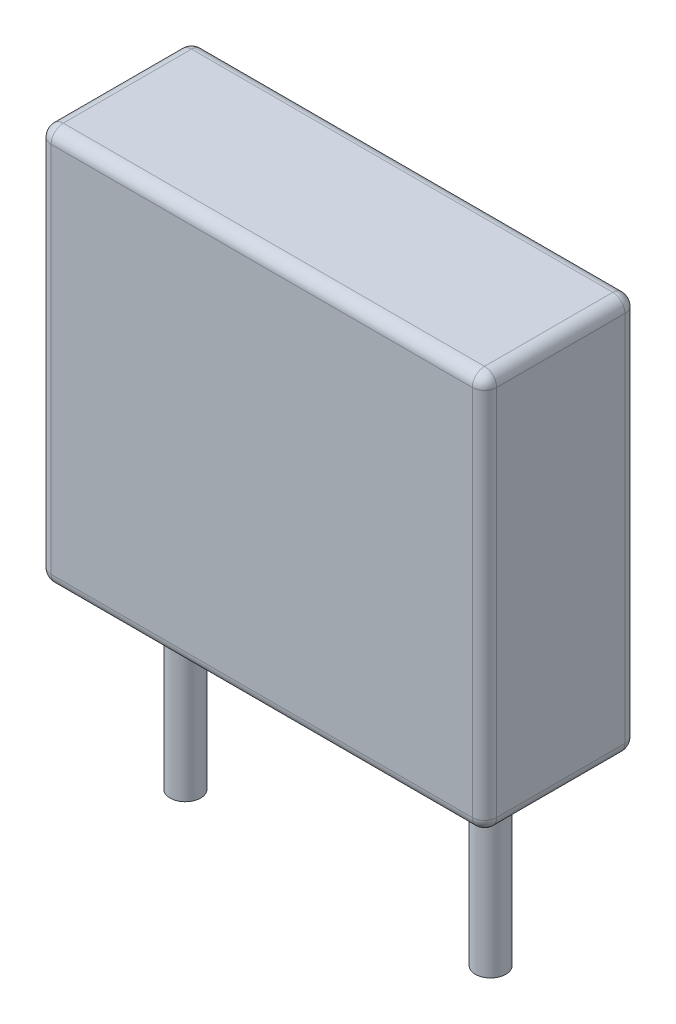
ISO-10303-21;
HEADER;
FILE_DESCRIPTION(('STEP AP214'),'2;1');
FILE_NAME('part.step','',(''),(''),'','','');
FILE_SCHEMA(('AUTOMOTIVE_DESIGN { 1 0 10303 214 1 1 1 1 }'));
ENDSEC;
DATA;
#1=APPLICATION_CONTEXT('core data for automotive mechanical design processes');
#2=APPLICATION_PROTOCOL_DEFINITION('international standard','automotive_design',2000,#1);
#3=PRODUCT_CONTEXT('',#1,'mechanical');
#4=PRODUCT('Part','Part','',(#3));
#5=PRODUCT_RELATED_PRODUCT_CATEGORY('part','',(#4));
#6=PRODUCT_DEFINITION_FORMATION('','',#4);
#7=PRODUCT_DEFINITION_CONTEXT('part definition',#1,'design');
#8=PRODUCT_DEFINITION('design','',#6,#7);
#9=PRODUCT_DEFINITION_SHAPE('','',#8);
#10=(LENGTH_UNIT() NAMED_UNIT(*) SI_UNIT(.MILLI.,.METRE.));
#11=(NAMED_UNIT(*) PLANE_ANGLE_UNIT() SI_UNIT($,.RADIAN.));
#12=(NAMED_UNIT(*) SI_UNIT($,.STERADIAN.) SOLID_ANGLE_UNIT());
#13=UNCERTAINTY_MEASURE_WITH_UNIT(LENGTH_MEASURE(1.E-05),#10,'distance_accuracy_value','');
#14=(GEOMETRIC_REPRESENTATION_CONTEXT(3) GLOBAL_UNCERTAINTY_ASSIGNED_CONTEXT((#13)) GLOBAL_UNIT_ASSIGNED_CONTEXT((#10,
#11,#12)) REPRESENTATION_CONTEXT('',''));
#15=CARTESIAN_POINT('',(0.,0.,0.));
#16=DIRECTION('',(0.,0.,1.));
#17=DIRECTION('',(1.,0.,0.));
#18=AXIS2_PLACEMENT_3D('',#15,#16,#17);
#19=CARTESIAN_POINT('',(2.5,-3.,0.));
#20=DIRECTION('',(0.,1.,0.));
#21=DIRECTION('',(0.,0.,1.));
#22=AXIS2_PLACEMENT_3D('',#19,#20,#21);
#23=CYLINDRICAL_SURFACE('',#22,0.25);
#24=CARTESIAN_POINT('',(2.5,-3.,0.));
#25=DIRECTION('',(0.,1.,0.));
#26=DIRECTION('',(0.,0.,1.));
#27=AXIS2_PLACEMENT_3D('',#24,#25,#26);
#28=CIRCLE('',#27,0.25);
#29=CARTESIAN_POINT('',(2.5,-3.,0.249999999999999));
#30=VERTEX_POINT('',#29);
#31=EDGE_CURVE('E11',#30,#30,#28,.T.);
#32=ORIENTED_EDGE('',*,*,#31,.T.);
#33=EDGE_LOOP('',(#32));
#34=FACE_BOUND('',#33,.T.);
#35=CARTESIAN_POINT('',(2.5,0.,0.));
#36=DIRECTION('',(0.,1.,0.));
#37=DIRECTION('',(0.,0.,1.));
#38=AXIS2_PLACEMENT_3D('',#35,#36,#37);
#39=CIRCLE('',#38,0.25);
#40=CARTESIAN_POINT('',(2.5,0.,0.249999999999999));
#41=VERTEX_POINT('',#40);
#42=EDGE_CURVE('E42',#41,#41,#39,.T.);
#43=ORIENTED_EDGE('',*,*,#42,.F.);
#44=EDGE_LOOP('',(#43));
#45=FACE_BOUND('',#44,.T.);
#46=ADVANCED_FACE('F39',(#34,#45),#23,.T.);
#47=CARTESIAN_POINT('',(2.5,-3.,0.));
#48=DIRECTION('',(0.,1.,0.));
#49=DIRECTION('',(0.,0.,1.));
#50=AXIS2_PLACEMENT_3D('',#47,#48,#49);
#51=PLANE('',#50);
#52=ORIENTED_EDGE('',*,*,#31,.F.);
#53=EDGE_LOOP('',(#52));
#54=FACE_BOUND('',#53,.T.);
#55=ADVANCED_FACE('F54',(#54),#51,.F.);
#56=CARTESIAN_POINT('',(2.5,0.,0.));
#57=DIRECTION('',(0.,1.,0.));
#58=DIRECTION('',(0.,0.,1.));
#59=AXIS2_PLACEMENT_3D('',#56,#57,#58);
#60=PLANE('',#59);
#61=ORIENTED_EDGE('',*,*,#42,.T.);
#62=EDGE_LOOP('',(#61));
#63=FACE_BOUND('',#62,.T.);
#64=ADVANCED_FACE('F51',(#63),#60,.T.);
#65=CLOSED_SHELL('',(#46,#55,#64));
#66=MANIFOLD_SOLID_BREP('B2',#65);
#67=CARTESIAN_POINT('',(-2.5,-3.,0.));
#68=DIRECTION('',(0.,1.,0.));
#69=DIRECTION('',(0.,0.,1.));
#70=AXIS2_PLACEMENT_3D('',#67,#68,#69);
#71=CYLINDRICAL_SURFACE('',#70,0.25);
#72=CARTESIAN_POINT('',(-2.5,-3.,0.));
#73=DIRECTION('',(0.,1.,0.));
#74=DIRECTION('',(0.,0.,1.));
#75=AXIS2_PLACEMENT_3D('',#72,#73,#74);
#76=CIRCLE('',#75,0.25);
#77=CARTESIAN_POINT('',(-2.5,-3.,0.250000000000001));
#78=VERTEX_POINT('',#77);
#79=EDGE_CURVE('E38',#78,#78,#76,.T.);
#80=ORIENTED_EDGE('',*,*,#79,.T.);
#81=EDGE_LOOP('',(#80));
#82=FACE_BOUND('',#81,.T.);
#83=CARTESIAN_POINT('',(-2.5,0.,0.));
#84=DIRECTION('',(0.,1.,0.));
#85=DIRECTION('',(0.,0.,1.));
#86=AXIS2_PLACEMENT_3D('',#83,#84,#85);
#87=CIRCLE('',#86,0.25);
#88=CARTESIAN_POINT('',(-2.5,0.,0.250000000000001));
#89=VERTEX_POINT('',#88);
#90=EDGE_CURVE('E91',#89,#89,#87,.T.);
#91=ORIENTED_EDGE('',*,*,#90,.F.);
#92=EDGE_LOOP('',(#91));
#93=FACE_BOUND('',#92,.T.);
#94=ADVANCED_FACE('F88',(#82,#93),#71,.T.);
#95=CARTESIAN_POINT('',(-2.5,-3.,0.));
#96=DIRECTION('',(0.,1.,0.));
#97=DIRECTION('',(0.,0.,1.));
#98=AXIS2_PLACEMENT_3D('',#95,#96,#97);
#99=PLANE('',#98);
#100=ORIENTED_EDGE('',*,*,#79,.F.);
#101=EDGE_LOOP('',(#100));
#102=FACE_BOUND('',#101,.T.);
#103=ADVANCED_FACE('F103',(#102),#99,.F.);
#104=CARTESIAN_POINT('',(-2.5,0.,0.));
#105=DIRECTION('',(0.,1.,0.));
#106=DIRECTION('',(0.,0.,1.));
#107=AXIS2_PLACEMENT_3D('',#104,#105,#106);
#108=PLANE('',#107);
#109=ORIENTED_EDGE('',*,*,#90,.T.);
#110=EDGE_LOOP('',(#109));
#111=FACE_BOUND('',#110,.T.);
#112=ADVANCED_FACE('F100',(#111),#108,.T.);
#113=CLOSED_SHELL('',(#94,#103,#112));
#114=MANIFOLD_SOLID_BREP('B6',#113);
#115=CARTESIAN_POINT('',(-3.65,6.5,1.25));
#116=DIRECTION('',(1.,0.,0.));
#117=DIRECTION('',(0.,0.,-1.));
#118=AXIS2_PLACEMENT_3D('',#115,#116,#117);
#119=PLANE('',#118);
#120=DIRECTION('',(0.,-1.,0.));
#121=VECTOR('',#120,1.);
#122=CARTESIAN_POINT('',(-3.65,6.5,-1.05));
#123=LINE('',#122,#121);
#124=CARTESIAN_POINT('',(-3.65,6.3,-1.05));
#125=VERTEX_POINT('',#124);
#126=CARTESIAN_POINT('',(-3.65,0.2,-1.05));
#127=VERTEX_POINT('',#126);
#128=EDGE_CURVE('E226',#125,#127,#123,.T.);
#129=ORIENTED_EDGE('',*,*,#128,.T.);
#130=DIRECTION('',(0.,0.,1.));
#131=VECTOR('',#130,1.);
#132=CARTESIAN_POINT('',(-3.65,0.2,1.25));
#133=LINE('',#132,#131);
#134=CARTESIAN_POINT('',(-3.65,0.2,1.05));
#135=VERTEX_POINT('',#134);
#136=EDGE_CURVE('E222',#127,#135,#133,.T.);
#137=ORIENTED_EDGE('',*,*,#136,.T.);
#138=DIRECTION('',(0.,-1.,0.));
#139=VECTOR('',#138,1.);
#140=CARTESIAN_POINT('',(-3.65,6.5,1.05));
#141=LINE('',#140,#139);
#142=CARTESIAN_POINT('',(-3.65,6.3,1.05));
#143=VERTEX_POINT('',#142);
#144=EDGE_CURVE('E217',#135,#143,#141,.F.);
#145=ORIENTED_EDGE('',*,*,#144,.T.);
#146=DIRECTION('',(0.,0.,1.));
#147=VECTOR('',#146,1.);
#148=CARTESIAN_POINT('',(-3.65,6.3,-1.25));
#149=LINE('',#148,#147);
#150=EDGE_CURVE('E219',#143,#125,#149,.F.);
#151=ORIENTED_EDGE('',*,*,#150,.T.);
#152=EDGE_LOOP('',(#129,#137,#145,#151));
#153=FACE_BOUND('',#152,.T.);
#154=ADVANCED_FACE('F129',(#153),#119,.F.);
#155=CARTESIAN_POINT('',(3.65,6.5,1.25));
#156=DIRECTION('',(0.,0.,-1.));
#157=DIRECTION('',(-1.,0.,0.));
#158=AXIS2_PLACEMENT_3D('',#155,#156,#157);
#159=PLANE('',#158);
#160=DIRECTION('',(0.,-1.,0.));
#161=VECTOR('',#160,1.);
#162=CARTESIAN_POINT('',(-3.45,6.5,1.25));
#163=LINE('',#162,#161);
#164=CARTESIAN_POINT('',(-3.45,6.3,1.25));
#165=VERTEX_POINT('',#164);
#166=CARTESIAN_POINT('',(-3.45,0.2,1.25));
#167=VERTEX_POINT('',#166);
#168=EDGE_CURVE('E248',#165,#167,#163,.T.);
#169=ORIENTED_EDGE('',*,*,#168,.T.);
#170=DIRECTION('',(1.,0.,0.));
#171=VECTOR('',#170,1.);
#172=CARTESIAN_POINT('',(3.65,0.2,1.25));
#173=LINE('',#172,#171);
#174=CARTESIAN_POINT('',(3.45,0.2,1.25));
#175=VERTEX_POINT('',#174);
#176=EDGE_CURVE('E326',#167,#175,#173,.T.);
#177=ORIENTED_EDGE('',*,*,#176,.T.);
#178=DIRECTION('',(0.,-1.,0.));
#179=VECTOR('',#178,1.);
#180=CARTESIAN_POINT('',(3.45,6.5,1.25));
#181=LINE('',#180,#179);
#182=CARTESIAN_POINT('',(3.45,6.3,1.25));
#183=VERTEX_POINT('',#182);
#184=EDGE_CURVE('E319',#175,#183,#181,.F.);
#185=ORIENTED_EDGE('',*,*,#184,.T.);
#186=DIRECTION('',(1.,0.,0.));
#187=VECTOR('',#186,1.);
#188=CARTESIAN_POINT('',(-3.65,6.3,1.25));
#189=LINE('',#188,#187);
#190=EDGE_CURVE('E317',#183,#165,#189,.F.);
#191=ORIENTED_EDGE('',*,*,#190,.T.);
#192=EDGE_LOOP('',(#169,#177,#185,#191));
#193=FACE_BOUND('',#192,.T.);
#194=ADVANCED_FACE('F416',(#193),#159,.F.);
#195=CARTESIAN_POINT('',(3.65,6.5,1.25));
#196=DIRECTION('',(-1.,0.,0.));
#197=DIRECTION('',(0.,0.,1.));
#198=AXIS2_PLACEMENT_3D('',#195,#196,#197);
#199=PLANE('',#198);
#200=DIRECTION('',(0.,0.,-1.));
#201=VECTOR('',#200,1.);
#202=CARTESIAN_POINT('',(3.65,0.2,1.25));
#203=LINE('',#202,#201);
#204=CARTESIAN_POINT('',(3.65,0.2,1.05));
#205=VERTEX_POINT('',#204);
#206=CARTESIAN_POINT('',(3.65,0.2,-1.05));
#207=VERTEX_POINT('',#206);
#208=EDGE_CURVE('E313',#205,#207,#203,.T.);
#209=ORIENTED_EDGE('',*,*,#208,.T.);
#210=DIRECTION('',(0.,-1.,0.));
#211=VECTOR('',#210,1.);
#212=CARTESIAN_POINT('',(3.65,6.5,-1.05));
#213=LINE('',#212,#211);
#214=CARTESIAN_POINT('',(3.65,6.3,-1.05));
#215=VERTEX_POINT('',#214);
#216=EDGE_CURVE('E310',#207,#215,#213,.F.);
#217=ORIENTED_EDGE('',*,*,#216,.T.);
#218=DIRECTION('',(0.,0.,-1.));
#219=VECTOR('',#218,1.);
#220=CARTESIAN_POINT('',(3.65,6.3,1.25));
#221=LINE('',#220,#219);
#222=CARTESIAN_POINT('',(3.65,6.3,1.05));
#223=VERTEX_POINT('',#222);
#224=EDGE_CURVE('E303',#215,#223,#221,.F.);
#225=ORIENTED_EDGE('',*,*,#224,.T.);
#226=DIRECTION('',(0.,-1.,0.));
#227=VECTOR('',#226,1.);
#228=CARTESIAN_POINT('',(3.65,6.5,1.05));
#229=LINE('',#228,#227);
#230=EDGE_CURVE('E306',#223,#205,#229,.T.);
#231=ORIENTED_EDGE('',*,*,#230,.T.);
#232=EDGE_LOOP('',(#209,#217,#225,#231));
#233=FACE_BOUND('',#232,.T.);
#234=ADVANCED_FACE('F311',(#233),#199,.F.);
#235=CARTESIAN_POINT('',(3.65,6.5,-1.25));
#236=DIRECTION('',(0.,0.,1.));
#237=DIRECTION('',(1.,0.,0.));
#238=AXIS2_PLACEMENT_3D('',#235,#236,#237);
#239=PLANE('',#238);
#240=DIRECTION('',(-1.,0.,0.));
#241=VECTOR('',#240,1.);
#242=CARTESIAN_POINT('',(3.65,0.2,-1.25));
#243=LINE('',#242,#241);
#244=CARTESIAN_POINT('',(3.45,0.2,-1.25));
#245=VERTEX_POINT('',#244);
#246=CARTESIAN_POINT('',(-3.45,0.2,-1.25));
#247=VERTEX_POINT('',#246);
#248=EDGE_CURVE('E375',#245,#247,#243,.T.);
#249=ORIENTED_EDGE('',*,*,#248,.T.);
#250=DIRECTION('',(0.,-1.,0.));
#251=VECTOR('',#250,1.);
#252=CARTESIAN_POINT('',(-3.45,6.5,-1.25));
#253=LINE('',#252,#251);
#254=CARTESIAN_POINT('',(-3.45,6.3,-1.25));
#255=VERTEX_POINT('',#254);
#256=EDGE_CURVE('E307',#247,#255,#253,.F.);
#257=ORIENTED_EDGE('',*,*,#256,.T.);
#258=DIRECTION('',(-1.,0.,0.));
#259=VECTOR('',#258,1.);
#260=CARTESIAN_POINT('',(3.65,6.3,-1.25));
#261=LINE('',#260,#259);
#262=CARTESIAN_POINT('',(3.45,6.3,-1.25));
#263=VERTEX_POINT('',#262);
#264=EDGE_CURVE('E368',#255,#263,#261,.F.);
#265=ORIENTED_EDGE('',*,*,#264,.T.);
#266=DIRECTION('',(0.,-1.,0.));
#267=VECTOR('',#266,1.);
#268=CARTESIAN_POINT('',(3.45,6.5,-1.25));
#269=LINE('',#268,#267);
#270=EDGE_CURVE('E370',#263,#245,#269,.T.);
#271=ORIENTED_EDGE('',*,*,#270,.T.);
#272=EDGE_LOOP('',(#249,#257,#265,#271));
#273=FACE_BOUND('',#272,.T.);
#274=ADVANCED_FACE('F400',(#273),#239,.F.);
#275=CARTESIAN_POINT('',(0.,6.5,0.));
#276=DIRECTION('',(0.,1.,0.));
#277=DIRECTION('',(0.,0.,1.));
#278=AXIS2_PLACEMENT_3D('',#275,#276,#277);
#279=PLANE('',#278);
#280=DIRECTION('',(0.,0.,-1.));
#281=VECTOR('',#280,1.);
#282=CARTESIAN_POINT('',(3.45,6.5,-1.25));
#283=LINE('',#282,#281);
#284=CARTESIAN_POINT('',(3.45,6.5,1.05));
#285=VERTEX_POINT('',#284);
#286=CARTESIAN_POINT('',(3.45,6.5,-1.05));
#287=VERTEX_POINT('',#286);
#288=EDGE_CURVE('E138',#285,#287,#283,.T.);
#289=ORIENTED_EDGE('',*,*,#288,.T.);
#290=DIRECTION('',(-1.,0.,0.));
#291=VECTOR('',#290,1.);
#292=CARTESIAN_POINT('',(-3.65,6.5,-1.05));
#293=LINE('',#292,#291);
#294=CARTESIAN_POINT('',(-3.45,6.5,-1.05));
#295=VERTEX_POINT('',#294);
#296=EDGE_CURVE('E86',#287,#295,#293,.T.);
#297=ORIENTED_EDGE('',*,*,#296,.T.);
#298=DIRECTION('',(0.,0.,1.));
#299=VECTOR('',#298,1.);
#300=CARTESIAN_POINT('',(-3.45,6.5,1.25));
#301=LINE('',#300,#299);
#302=CARTESIAN_POINT('',(-3.45,6.5,1.05));
#303=VERTEX_POINT('',#302);
#304=EDGE_CURVE('E328',#295,#303,#301,.T.);
#305=ORIENTED_EDGE('',*,*,#304,.T.);
#306=DIRECTION('',(1.,0.,0.));
#307=VECTOR('',#306,1.);
#308=CARTESIAN_POINT('',(3.65,6.5,1.05));
#309=LINE('',#308,#307);
#310=EDGE_CURVE('E149',#303,#285,#309,.T.);
#311=ORIENTED_EDGE('',*,*,#310,.T.);
#312=EDGE_LOOP('',(#289,#297,#305,#311));
#313=FACE_BOUND('',#312,.T.);
#314=ADVANCED_FACE('F579',(#313),#279,.T.);
#315=CARTESIAN_POINT('',(0.,0.,0.));
#316=DIRECTION('',(0.,1.,0.));
#317=DIRECTION('',(0.,0.,1.));
#318=AXIS2_PLACEMENT_3D('',#315,#316,#317);
#319=PLANE('',#318);
#320=DIRECTION('',(1.,0.,0.));
#321=VECTOR('',#320,1.);
#322=CARTESIAN_POINT('',(0.,0.,1.05));
#323=LINE('',#322,#321);
#324=CARTESIAN_POINT('',(3.45,0.,1.05));
#325=VERTEX_POINT('',#324);
#326=CARTESIAN_POINT('',(-3.45,0.,1.05));
#327=VERTEX_POINT('',#326);
#328=EDGE_CURVE('E364',#325,#327,#323,.F.);
#329=ORIENTED_EDGE('',*,*,#328,.T.);
#330=DIRECTION('',(0.,0.,1.));
#331=VECTOR('',#330,1.);
#332=CARTESIAN_POINT('',(-3.45,0.,0.));
#333=LINE('',#332,#331);
#334=CARTESIAN_POINT('',(-3.45,0.,-1.05));
#335=VERTEX_POINT('',#334);
#336=EDGE_CURVE('E358',#327,#335,#333,.F.);
#337=ORIENTED_EDGE('',*,*,#336,.T.);
#338=DIRECTION('',(-1.,0.,0.));
#339=VECTOR('',#338,1.);
#340=CARTESIAN_POINT('',(0.,0.,-1.05));
#341=LINE('',#340,#339);
#342=CARTESIAN_POINT('',(3.45,0.,-1.05));
#343=VERTEX_POINT('',#342);
#344=EDGE_CURVE('E352',#335,#343,#341,.F.);
#345=ORIENTED_EDGE('',*,*,#344,.T.);
#346=DIRECTION('',(0.,0.,-1.));
#347=VECTOR('',#346,1.);
#348=CARTESIAN_POINT('',(3.45,0.,0.));
#349=LINE('',#348,#347);
#350=EDGE_CURVE('E359',#343,#325,#349,.F.);
#351=ORIENTED_EDGE('',*,*,#350,.T.);
#352=EDGE_LOOP('',(#329,#337,#345,#351));
#353=FACE_BOUND('',#352,.T.);
#354=ADVANCED_FACE('F362',(#353),#319,.F.);
#355=CARTESIAN_POINT('',(3.45,6.3,0.));
#356=DIRECTION('',(0.,0.,1.));
#357=DIRECTION('',(1.,0.,0.));
#358=AXIS2_PLACEMENT_3D('',#355,#356,#357);
#359=CYLINDRICAL_SURFACE('',#358,0.2);
#360=CARTESIAN_POINT('',(3.45,6.3,-1.05));
#361=DIRECTION('',(0.,0.,-1.));
#362=DIRECTION('',(-1.,0.,0.));
#363=AXIS2_PLACEMENT_3D('',#360,#361,#362);
#364=CIRCLE('',#363,0.2);
#365=EDGE_CURVE('E133',#287,#215,#364,.T.);
#366=ORIENTED_EDGE('',*,*,#365,.F.);
#367=ORIENTED_EDGE('',*,*,#288,.F.);
#368=CARTESIAN_POINT('',(3.45,6.3,1.05));
#369=DIRECTION('',(0.,0.,1.));
#370=DIRECTION('',(1.,0.,0.));
#371=AXIS2_PLACEMENT_3D('',#368,#369,#370);
#372=CIRCLE('',#371,0.2);
#373=EDGE_CURVE('E288',#223,#285,#372,.T.);
#374=ORIENTED_EDGE('',*,*,#373,.F.);
#375=ORIENTED_EDGE('',*,*,#224,.F.);
#376=EDGE_LOOP('',(#366,#367,#374,#375));
#377=FACE_BOUND('',#376,.T.);
#378=ADVANCED_FACE('F131',(#377),#359,.T.);
#379=CARTESIAN_POINT('',(3.45,6.3,-1.05));
#380=DIRECTION('',(1.,0.,0.));
#381=DIRECTION('',(0.,0.,-1.));
#382=AXIS2_PLACEMENT_3D('',#379,#380,#381);
#383=SPHERICAL_SURFACE('',#382,0.2);
#384=CARTESIAN_POINT('',(3.45,6.3,-1.05));
#385=DIRECTION('',(1.,0.,0.));
#386=DIRECTION('',(0.,0.,-1.));
#387=AXIS2_PLACEMENT_3D('',#384,#385,#386);
#388=CIRCLE('',#387,0.2);
#389=EDGE_CURVE('E284',#287,#263,#388,.F.);
#390=ORIENTED_EDGE('',*,*,#389,.F.);
#391=ORIENTED_EDGE('',*,*,#365,.T.);
#392=CARTESIAN_POINT('',(3.45,6.3,-1.05));
#393=DIRECTION('',(0.,1.,0.));
#394=DIRECTION('',(0.,0.,1.));
#395=AXIS2_PLACEMENT_3D('',#392,#393,#394);
#396=CIRCLE('',#395,0.2);
#397=EDGE_CURVE('E287',#263,#215,#396,.F.);
#398=ORIENTED_EDGE('',*,*,#397,.F.);
#399=EDGE_LOOP('',(#390,#391,#398));
#400=FACE_BOUND('',#399,.T.);
#401=ADVANCED_FACE('F299',(#400),#383,.T.);
#402=CARTESIAN_POINT('',(3.45,6.3,1.05));
#403=DIRECTION('',(0.,1.,0.));
#404=DIRECTION('',(0.,0.,1.));
#405=AXIS2_PLACEMENT_3D('',#402,#403,#404);
#406=SPHERICAL_SURFACE('',#405,0.2);
#407=CARTESIAN_POINT('',(3.45,6.3,1.05));
#408=DIRECTION('',(0.,1.,0.));
#409=DIRECTION('',(0.,0.,1.));
#410=AXIS2_PLACEMENT_3D('',#407,#408,#409);
#411=CIRCLE('',#410,0.2);
#412=EDGE_CURVE('E278',#223,#183,#411,.F.);
#413=ORIENTED_EDGE('',*,*,#412,.F.);
#414=ORIENTED_EDGE('',*,*,#373,.T.);
#415=CARTESIAN_POINT('',(3.45,6.3,1.05));
#416=DIRECTION('',(1.,0.,0.));
#417=DIRECTION('',(0.,0.,-1.));
#418=AXIS2_PLACEMENT_3D('',#415,#416,#417);
#419=CIRCLE('',#418,0.2);
#420=EDGE_CURVE('E281',#183,#285,#419,.F.);
#421=ORIENTED_EDGE('',*,*,#420,.F.);
#422=EDGE_LOOP('',(#413,#414,#421));
#423=FACE_BOUND('',#422,.T.);
#424=ADVANCED_FACE('F552',(#423),#406,.T.);
#425=CARTESIAN_POINT('',(3.45,6.5,-1.05));
#426=DIRECTION('',(0.,-1.,0.));
#427=DIRECTION('',(0.,0.,-1.));
#428=AXIS2_PLACEMENT_3D('',#425,#426,#427);
#429=CYLINDRICAL_SURFACE('',#428,0.2);
#430=ORIENTED_EDGE('',*,*,#397,.T.);
#431=ORIENTED_EDGE('',*,*,#216,.F.);
#432=CARTESIAN_POINT('',(3.45,0.2,-1.05));
#433=DIRECTION('',(0.,-1.,0.));
#434=DIRECTION('',(0.,0.,-1.));
#435=AXIS2_PLACEMENT_3D('',#432,#433,#434);
#436=CIRCLE('',#435,0.2);
#437=EDGE_CURVE('E272',#245,#207,#436,.T.);
#438=ORIENTED_EDGE('',*,*,#437,.F.);
#439=ORIENTED_EDGE('',*,*,#270,.F.);
#440=EDGE_LOOP('',(#430,#431,#438,#439));
#441=FACE_BOUND('',#440,.T.);
#442=ADVANCED_FACE('F402',(#441),#429,.T.);
#443=CARTESIAN_POINT('',(0.,6.3,-1.05));
#444=DIRECTION('',(1.,0.,0.));
#445=DIRECTION('',(0.,0.,-1.));
#446=AXIS2_PLACEMENT_3D('',#443,#444,#445);
#447=CYLINDRICAL_SURFACE('',#446,0.2);
#448=ORIENTED_EDGE('',*,*,#389,.T.);
#449=ORIENTED_EDGE('',*,*,#264,.F.);
#450=CARTESIAN_POINT('',(-3.45,6.3,-1.05));
#451=DIRECTION('',(-1.,0.,0.));
#452=DIRECTION('',(0.,0.,1.));
#453=AXIS2_PLACEMENT_3D('',#450,#451,#452);
#454=CIRCLE('',#453,0.2);
#455=EDGE_CURVE('E269',#295,#255,#454,.T.);
#456=ORIENTED_EDGE('',*,*,#455,.F.);
#457=ORIENTED_EDGE('',*,*,#296,.F.);
#458=EDGE_LOOP('',(#448,#449,#456,#457));
#459=FACE_BOUND('',#458,.T.);
#460=ADVANCED_FACE('F536',(#459),#447,.T.);
#461=CARTESIAN_POINT('',(-3.45,6.3,0.));
#462=DIRECTION('',(0.,0.,-1.));
#463=DIRECTION('',(-1.,0.,0.));
#464=AXIS2_PLACEMENT_3D('',#461,#462,#463);
#465=CYLINDRICAL_SURFACE('',#464,0.2);
#466=CARTESIAN_POINT('',(-3.45,6.3,1.05));
#467=DIRECTION('',(0.,0.,1.));
#468=DIRECTION('',(1.,0.,0.));
#469=AXIS2_PLACEMENT_3D('',#466,#467,#468);
#470=CIRCLE('',#469,0.2);
#471=EDGE_CURVE('E233',#303,#143,#470,.T.);
#472=ORIENTED_EDGE('',*,*,#471,.F.);
#473=ORIENTED_EDGE('',*,*,#304,.F.);
#474=CARTESIAN_POINT('',(-3.45,6.3,-1.05));
#475=DIRECTION('',(0.,0.,-1.));
#476=DIRECTION('',(0.,1.,0.));
#477=AXIS2_PLACEMENT_3D('',#474,#475,#476);
#478=CIRCLE('',#477,0.2);
#479=EDGE_CURVE('E235',#125,#295,#478,.T.);
#480=ORIENTED_EDGE('',*,*,#479,.F.);
#481=ORIENTED_EDGE('',*,*,#150,.F.);
#482=EDGE_LOOP('',(#472,#473,#480,#481));
#483=FACE_BOUND('',#482,.T.);
#484=ADVANCED_FACE('F231',(#483),#465,.T.);
#485=CARTESIAN_POINT('',(0.,6.3,1.05));
#486=DIRECTION('',(-1.,0.,0.));
#487=DIRECTION('',(0.,0.,1.));
#488=AXIS2_PLACEMENT_3D('',#485,#486,#487);
#489=CYLINDRICAL_SURFACE('',#488,0.2);
#490=ORIENTED_EDGE('',*,*,#420,.T.);
#491=ORIENTED_EDGE('',*,*,#310,.F.);
#492=CARTESIAN_POINT('',(-3.45,6.3,1.05));
#493=DIRECTION('',(-1.,0.,0.));
#494=DIRECTION('',(0.,-1.,0.));
#495=AXIS2_PLACEMENT_3D('',#492,#493,#494);
#496=CIRCLE('',#495,0.2);
#497=EDGE_CURVE('E244',#165,#303,#496,.T.);
#498=ORIENTED_EDGE('',*,*,#497,.F.);
#499=ORIENTED_EDGE('',*,*,#190,.F.);
#500=EDGE_LOOP('',(#490,#491,#498,#499));
#501=FACE_BOUND('',#500,.T.);
#502=ADVANCED_FACE('F520',(#501),#489,.T.);
#503=CARTESIAN_POINT('',(3.45,6.5,1.05));
#504=DIRECTION('',(0.,-1.,0.));
#505=DIRECTION('',(0.,0.,-1.));
#506=AXIS2_PLACEMENT_3D('',#503,#504,#505);
#507=CYLINDRICAL_SURFACE('',#506,0.2);
#508=ORIENTED_EDGE('',*,*,#412,.T.);
#509=ORIENTED_EDGE('',*,*,#184,.F.);
#510=CARTESIAN_POINT('',(3.45,0.2,1.05));
#511=DIRECTION('',(0.,-1.,0.));
#512=DIRECTION('',(0.,0.,-1.));
#513=AXIS2_PLACEMENT_3D('',#510,#511,#512);
#514=CIRCLE('',#513,0.2);
#515=EDGE_CURVE('E264',#205,#175,#514,.T.);
#516=ORIENTED_EDGE('',*,*,#515,.F.);
#517=ORIENTED_EDGE('',*,*,#230,.F.);
#518=EDGE_LOOP('',(#508,#509,#516,#517));
#519=FACE_BOUND('',#518,.T.);
#520=ADVANCED_FACE('F386',(#519),#507,.T.);
#521=CARTESIAN_POINT('',(3.45,0.2,1.25));
#522=DIRECTION('',(0.,0.,-1.));
#523=DIRECTION('',(-1.,0.,0.));
#524=AXIS2_PLACEMENT_3D('',#521,#522,#523);
#525=CYLINDRICAL_SURFACE('',#524,0.2);
#526=CARTESIAN_POINT('',(3.45,0.2,-1.05));
#527=DIRECTION('',(0.,0.,-1.));
#528=DIRECTION('',(-1.,0.,0.));
#529=AXIS2_PLACEMENT_3D('',#526,#527,#528);
#530=CIRCLE('',#529,0.2);
#531=EDGE_CURVE('E275',#207,#343,#530,.T.);
#532=ORIENTED_EDGE('',*,*,#531,.F.);
#533=ORIENTED_EDGE('',*,*,#208,.F.);
#534=CARTESIAN_POINT('',(3.45,0.2,1.05));
#535=DIRECTION('',(0.,0.,1.));
#536=DIRECTION('',(1.,0.,0.));
#537=AXIS2_PLACEMENT_3D('',#534,#535,#536);
#538=CIRCLE('',#537,0.2);
#539=EDGE_CURVE('E261',#325,#205,#538,.T.);
#540=ORIENTED_EDGE('',*,*,#539,.F.);
#541=ORIENTED_EDGE('',*,*,#350,.F.);
#542=EDGE_LOOP('',(#532,#533,#540,#541));
#543=FACE_BOUND('',#542,.T.);
#544=ADVANCED_FACE('F383',(#543),#525,.T.);
#545=CARTESIAN_POINT('',(3.45,0.2,-1.05));
#546=DIRECTION('',(1.,0.,0.));
#547=DIRECTION('',(0.,1.,0.));
#548=AXIS2_PLACEMENT_3D('',#545,#546,#547);
#549=SPHERICAL_SURFACE('',#548,0.2);
#550=ORIENTED_EDGE('',*,*,#437,.T.);
#551=ORIENTED_EDGE('',*,*,#531,.T.);
#552=CARTESIAN_POINT('',(3.45,0.2,-1.05));
#553=DIRECTION('',(1.,0.,0.));
#554=DIRECTION('',(0.,0.,-1.));
#555=AXIS2_PLACEMENT_3D('',#552,#553,#554);
#556=CIRCLE('',#555,0.2);
#557=EDGE_CURVE('E252',#245,#343,#556,.F.);
#558=ORIENTED_EDGE('',*,*,#557,.F.);
#559=EDGE_LOOP('',(#550,#551,#558));
#560=FACE_BOUND('',#559,.T.);
#561=ADVANCED_FACE('F404',(#560),#549,.T.);
#562=CARTESIAN_POINT('',(-3.45,6.3,-1.05));
#563=DIRECTION('',(0.,1.,0.));
#564=DIRECTION('',(0.,0.,1.));
#565=AXIS2_PLACEMENT_3D('',#562,#563,#564);
#566=SPHERICAL_SURFACE('',#565,0.2);
#567=ORIENTED_EDGE('',*,*,#479,.T.);
#568=ORIENTED_EDGE('',*,*,#455,.T.);
#569=CARTESIAN_POINT('',(-3.45,6.3,-1.05));
#570=DIRECTION('',(0.,1.,0.));
#571=DIRECTION('',(0.,0.,1.));
#572=AXIS2_PLACEMENT_3D('',#569,#570,#571);
#573=CIRCLE('',#572,0.2);
#574=EDGE_CURVE('E249',#125,#255,#573,.F.);
#575=ORIENTED_EDGE('',*,*,#574,.F.);
#576=EDGE_LOOP('',(#567,#568,#575));
#577=FACE_BOUND('',#576,.T.);
#578=ADVANCED_FACE('F406',(#577),#566,.T.);
#579=CARTESIAN_POINT('',(-3.45,6.3,1.05));
#580=DIRECTION('',(0.,1.,0.));
#581=DIRECTION('',(0.,0.,1.));
#582=AXIS2_PLACEMENT_3D('',#579,#580,#581);
#583=SPHERICAL_SURFACE('',#582,0.2);
#584=ORIENTED_EDGE('',*,*,#497,.T.);
#585=ORIENTED_EDGE('',*,*,#471,.T.);
#586=CARTESIAN_POINT('',(-3.45,6.3,1.05));
#587=DIRECTION('',(0.,1.,0.));
#588=DIRECTION('',(0.,0.,1.));
#589=AXIS2_PLACEMENT_3D('',#586,#587,#588);
#590=CIRCLE('',#589,0.2);
#591=EDGE_CURVE('E241',#165,#143,#590,.F.);
#592=ORIENTED_EDGE('',*,*,#591,.F.);
#593=EDGE_LOOP('',(#584,#585,#592));
#594=FACE_BOUND('',#593,.T.);
#595=ADVANCED_FACE('F240',(#594),#583,.T.);
#596=CARTESIAN_POINT('',(3.45,0.2,1.05));
#597=DIRECTION('',(1.,0.,0.));
#598=DIRECTION('',(0.,1.,0.));
#599=AXIS2_PLACEMENT_3D('',#596,#597,#598);
#600=SPHERICAL_SURFACE('',#599,0.2);
#601=ORIENTED_EDGE('',*,*,#539,.T.);
#602=ORIENTED_EDGE('',*,*,#515,.T.);
#603=CARTESIAN_POINT('',(3.45,0.2,1.05));
#604=DIRECTION('',(1.,0.,0.));
#605=DIRECTION('',(0.,0.,-1.));
#606=AXIS2_PLACEMENT_3D('',#603,#604,#605);
#607=CIRCLE('',#606,0.2);
#608=EDGE_CURVE('E250',#325,#175,#607,.F.);
#609=ORIENTED_EDGE('',*,*,#608,.F.);
#610=EDGE_LOOP('',(#601,#602,#609));
#611=FACE_BOUND('',#610,.T.);
#612=ADVANCED_FACE('F388',(#611),#600,.T.);
#613=CARTESIAN_POINT('',(3.65,0.2,-1.05));
#614=DIRECTION('',(-1.,0.,0.));
#615=DIRECTION('',(0.,0.,1.));
#616=AXIS2_PLACEMENT_3D('',#613,#614,#615);
#617=CYLINDRICAL_SURFACE('',#616,0.2);
#618=ORIENTED_EDGE('',*,*,#557,.T.);
#619=ORIENTED_EDGE('',*,*,#344,.F.);
#620=CARTESIAN_POINT('',(-3.45,0.2,-1.05));
#621=DIRECTION('',(-1.,0.,0.));
#622=DIRECTION('',(0.,0.,1.));
#623=AXIS2_PLACEMENT_3D('',#620,#621,#622);
#624=CIRCLE('',#623,0.2);
#625=EDGE_CURVE('E255',#247,#335,#624,.T.);
#626=ORIENTED_EDGE('',*,*,#625,.F.);
#627=ORIENTED_EDGE('',*,*,#248,.F.);
#628=EDGE_LOOP('',(#618,#619,#626,#627));
#629=FACE_BOUND('',#628,.T.);
#630=ADVANCED_FACE('F354',(#629),#617,.T.);
#631=CARTESIAN_POINT('',(-3.45,6.5,-1.05));
#632=DIRECTION('',(0.,-1.,0.));
#633=DIRECTION('',(0.,0.,-1.));
#634=AXIS2_PLACEMENT_3D('',#631,#632,#633);
#635=CYLINDRICAL_SURFACE('',#634,0.2);
#636=ORIENTED_EDGE('',*,*,#574,.T.);
#637=ORIENTED_EDGE('',*,*,#256,.F.);
#638=CARTESIAN_POINT('',(-3.45,0.2,-1.05));
#639=DIRECTION('',(0.,-1.,0.));
#640=DIRECTION('',(0.,0.,-1.));
#641=AXIS2_PLACEMENT_3D('',#638,#639,#640);
#642=CIRCLE('',#641,0.2);
#643=EDGE_CURVE('E341',#127,#247,#642,.T.);
#644=ORIENTED_EDGE('',*,*,#643,.F.);
#645=ORIENTED_EDGE('',*,*,#128,.F.);
#646=EDGE_LOOP('',(#636,#637,#644,#645));
#647=FACE_BOUND('',#646,.T.);
#648=ADVANCED_FACE('F398',(#647),#635,.T.);
#649=CARTESIAN_POINT('',(-3.45,6.5,1.05));
#650=DIRECTION('',(0.,-1.,0.));
#651=DIRECTION('',(0.,0.,-1.));
#652=AXIS2_PLACEMENT_3D('',#649,#650,#651);
#653=CYLINDRICAL_SURFACE('',#652,0.2);
#654=ORIENTED_EDGE('',*,*,#591,.T.);
#655=ORIENTED_EDGE('',*,*,#144,.F.);
#656=CARTESIAN_POINT('',(-3.45,0.2,1.05));
#657=DIRECTION('',(0.,-1.,0.));
#658=DIRECTION('',(0.,0.,-1.));
#659=AXIS2_PLACEMENT_3D('',#656,#657,#658);
#660=CIRCLE('',#659,0.2);
#661=EDGE_CURVE('E338',#167,#135,#660,.T.);
#662=ORIENTED_EDGE('',*,*,#661,.F.);
#663=ORIENTED_EDGE('',*,*,#168,.F.);
#664=EDGE_LOOP('',(#654,#655,#662,#663));
#665=FACE_BOUND('',#664,.T.);
#666=ADVANCED_FACE('F246',(#665),#653,.T.);
#667=CARTESIAN_POINT('',(3.65,0.2,1.05));
#668=DIRECTION('',(1.,0.,0.));
#669=DIRECTION('',(0.,0.,-1.));
#670=AXIS2_PLACEMENT_3D('',#667,#668,#669);
#671=CYLINDRICAL_SURFACE('',#670,0.2);
#672=ORIENTED_EDGE('',*,*,#608,.T.);
#673=ORIENTED_EDGE('',*,*,#176,.F.);
#674=CARTESIAN_POINT('',(-3.45,0.2,1.05));
#675=DIRECTION('',(-1.,0.,0.));
#676=DIRECTION('',(0.,0.,1.));
#677=AXIS2_PLACEMENT_3D('',#674,#675,#676);
#678=CIRCLE('',#677,0.2);
#679=EDGE_CURVE('E336',#327,#167,#678,.T.);
#680=ORIENTED_EDGE('',*,*,#679,.F.);
#681=ORIENTED_EDGE('',*,*,#328,.F.);
#682=EDGE_LOOP('',(#672,#673,#680,#681));
#683=FACE_BOUND('',#682,.T.);
#684=ADVANCED_FACE('F391',(#683),#671,.T.);
#685=CARTESIAN_POINT('',(-3.45,0.2,-1.05));
#686=DIRECTION('',(0.,0.,-1.));
#687=DIRECTION('',(0.,1.,0.));
#688=AXIS2_PLACEMENT_3D('',#685,#686,#687);
#689=SPHERICAL_SURFACE('',#688,0.2);
#690=ORIENTED_EDGE('',*,*,#643,.T.);
#691=ORIENTED_EDGE('',*,*,#625,.T.);
#692=CARTESIAN_POINT('',(-3.45,0.2,-1.05));
#693=DIRECTION('',(0.,0.,-1.));
#694=DIRECTION('',(-1.,0.,0.));
#695=AXIS2_PLACEMENT_3D('',#692,#693,#694);
#696=CIRCLE('',#695,0.2);
#697=EDGE_CURVE('E334',#127,#335,#696,.F.);
#698=ORIENTED_EDGE('',*,*,#697,.F.);
#699=EDGE_LOOP('',(#690,#691,#698));
#700=FACE_BOUND('',#699,.T.);
#701=ADVANCED_FACE('F348',(#700),#689,.T.);
#702=CARTESIAN_POINT('',(-3.45,0.2,1.05));
#703=DIRECTION('',(0.,0.,1.));
#704=DIRECTION('',(1.,0.,0.));
#705=AXIS2_PLACEMENT_3D('',#702,#703,#704);
#706=SPHERICAL_SURFACE('',#705,0.2);
#707=ORIENTED_EDGE('',*,*,#679,.T.);
#708=ORIENTED_EDGE('',*,*,#661,.T.);
#709=CARTESIAN_POINT('',(-3.45,0.2,1.05));
#710=DIRECTION('',(0.,0.,1.));
#711=DIRECTION('',(1.,0.,0.));
#712=AXIS2_PLACEMENT_3D('',#709,#710,#711);
#713=CIRCLE('',#712,0.2);
#714=EDGE_CURVE('E332',#327,#135,#713,.F.);
#715=ORIENTED_EDGE('',*,*,#714,.F.);
#716=EDGE_LOOP('',(#707,#708,#715));
#717=FACE_BOUND('',#716,.T.);
#718=ADVANCED_FACE('F428',(#717),#706,.T.);
#719=CARTESIAN_POINT('',(-3.45,0.2,1.25));
#720=DIRECTION('',(0.,0.,1.));
#721=DIRECTION('',(1.,0.,0.));
#722=AXIS2_PLACEMENT_3D('',#719,#720,#721);
#723=CYLINDRICAL_SURFACE('',#722,0.2);
#724=ORIENTED_EDGE('',*,*,#697,.T.);
#725=ORIENTED_EDGE('',*,*,#336,.F.);
#726=ORIENTED_EDGE('',*,*,#714,.T.);
#727=ORIENTED_EDGE('',*,*,#136,.F.);
#728=EDGE_LOOP('',(#724,#725,#726,#727));
#729=FACE_BOUND('',#728,.T.);
#730=ADVANCED_FACE('F425',(#729),#723,.T.);
#731=CLOSED_SHELL('',(#154,#194,#234,#274,#314,#354,#378,#401,#424,#442,#460,#484,#502,#520,
#544,#561,#578,#595,#612,#630,#648,#666,#684,#701,#718,#730));
#732=MANIFOLD_SOLID_BREP('B33',#731);
#733=ADVANCED_BREP_SHAPE_REPRESENTATION('',(#18,#66,#114,#732),#14);
#734=SHAPE_DEFINITION_REPRESENTATION(#9,#733);
ENDSEC;
END-ISO-10303-21;
